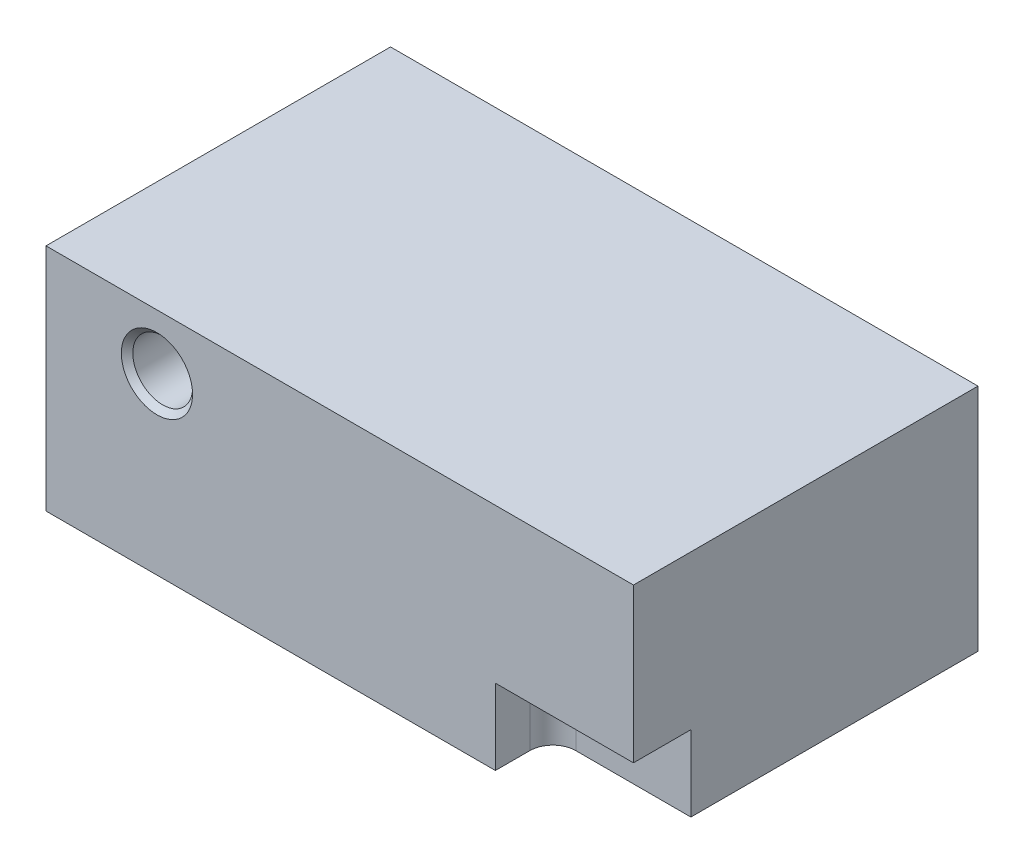
ISO-10303-21;
HEADER;
FILE_DESCRIPTION(('STEP AP214'),'2;1');
FILE_NAME('part.step','',(''),(''),'','','');
FILE_SCHEMA(('AUTOMOTIVE_DESIGN { 1 0 10303 214 1 1 1 1 }'));
ENDSEC;
DATA;
#1=APPLICATION_CONTEXT('core data for automotive mechanical design processes');
#2=APPLICATION_PROTOCOL_DEFINITION('international standard','automotive_design',2000,#1);
#3=PRODUCT_CONTEXT('',#1,'mechanical');
#4=PRODUCT('Part','Part','',(#3));
#5=PRODUCT_RELATED_PRODUCT_CATEGORY('part','',(#4));
#6=PRODUCT_DEFINITION_FORMATION('','',#4);
#7=PRODUCT_DEFINITION_CONTEXT('part definition',#1,'design');
#8=PRODUCT_DEFINITION('design','',#6,#7);
#9=PRODUCT_DEFINITION_SHAPE('','',#8);
#10=(LENGTH_UNIT() NAMED_UNIT(*) SI_UNIT(.MILLI.,.METRE.));
#11=(NAMED_UNIT(*) PLANE_ANGLE_UNIT() SI_UNIT($,.RADIAN.));
#12=(NAMED_UNIT(*) SI_UNIT($,.STERADIAN.) SOLID_ANGLE_UNIT());
#13=UNCERTAINTY_MEASURE_WITH_UNIT(LENGTH_MEASURE(1.E-05),#10,'distance_accuracy_value','');
#14=(GEOMETRIC_REPRESENTATION_CONTEXT(3) GLOBAL_UNCERTAINTY_ASSIGNED_CONTEXT((#13)) GLOBAL_UNIT_ASSIGNED_CONTEXT((#10,
#11,#12)) REPRESENTATION_CONTEXT('',''));
#15=CARTESIAN_POINT('',(0.,0.,0.));
#16=DIRECTION('',(0.,0.,1.));
#17=DIRECTION('',(1.,0.,0.));
#18=AXIS2_PLACEMENT_3D('',#15,#16,#17);
#19=CARTESIAN_POINT('',(0.,508.,0.));
#20=DIRECTION('',(1.,0.,0.));
#21=DIRECTION('',(0.,0.,-1.));
#22=AXIS2_PLACEMENT_3D('',#19,#20,#21);
#23=PLANE('',#22);
#24=DIRECTION('',(0.,0.,1.));
#25=VECTOR('',#24,1.);
#26=CARTESIAN_POINT('',(0.,0.,0.));
#27=LINE('',#26,#25);
#28=CARTESIAN_POINT('',(0.,0.,0.));
#29=VERTEX_POINT('',#28);
#30=CARTESIAN_POINT('',(0.,0.,762.));
#31=VERTEX_POINT('',#30);
#32=EDGE_CURVE('E156',#29,#31,#27,.T.);
#33=ORIENTED_EDGE('',*,*,#32,.T.);
#34=DIRECTION('',(0.,-1.,0.));
#35=VECTOR('',#34,1.);
#36=CARTESIAN_POINT('',(0.,508.,762.));
#37=LINE('',#36,#35);
#38=CARTESIAN_POINT('',(0.,508.,762.));
#39=VERTEX_POINT('',#38);
#40=EDGE_CURVE('E178',#39,#31,#37,.T.);
#41=ORIENTED_EDGE('',*,*,#40,.F.);
#42=DIRECTION('',(0.,0.,1.));
#43=VECTOR('',#42,1.);
#44=CARTESIAN_POINT('',(0.,508.,0.));
#45=LINE('',#44,#43);
#46=CARTESIAN_POINT('',(0.,508.,0.));
#47=VERTEX_POINT('',#46);
#48=EDGE_CURVE('E141',#47,#39,#45,.T.);
#49=ORIENTED_EDGE('',*,*,#48,.F.);
#50=DIRECTION('',(0.,-1.,0.));
#51=VECTOR('',#50,1.);
#52=CARTESIAN_POINT('',(0.,508.,0.));
#53=LINE('',#52,#51);
#54=EDGE_CURVE('E155',#47,#29,#53,.T.);
#55=ORIENTED_EDGE('',*,*,#54,.T.);
#56=EDGE_LOOP('',(#33,#41,#49,#55));
#57=FACE_BOUND('',#56,.T.);
#58=ADVANCED_FACE('F41',(#57),#23,.F.);
#59=CARTESIAN_POINT('',(0.,508.,762.));
#60=DIRECTION('',(0.,0.,-1.));
#61=DIRECTION('',(-1.,0.,0.));
#62=AXIS2_PLACEMENT_3D('',#59,#60,#61);
#63=PLANE('',#62);
#64=CARTESIAN_POINT('',(245.395602091104,385.783170348567,762.));
#65=DIRECTION('',(0.,0.,-1.));
#66=DIRECTION('',(-1.,0.,0.));
#67=AXIS2_PLACEMENT_3D('',#64,#65,#66);
#68=CIRCLE('',#67,78.765626010525);
#69=CARTESIAN_POINT('',(166.629976080579,385.783170348567,762.));
#70=VERTEX_POINT('',#69);
#71=EDGE_CURVE('E190',#70,#70,#68,.T.);
#72=ORIENTED_EDGE('',*,*,#71,.T.);
#73=EDGE_LOOP('',(#72));
#74=FACE_BOUND('',#73,.T.);
#75=DIRECTION('',(1.,0.,0.));
#76=VECTOR('',#75,1.);
#77=CARTESIAN_POINT('',(0.,0.,762.));
#78=LINE('',#77,#76);
#79=CARTESIAN_POINT('',(993.88614939054,0.,762.));
#80=VERTEX_POINT('',#79);
#81=EDGE_CURVE('E160',#31,#80,#78,.T.);
#82=ORIENTED_EDGE('',*,*,#81,.T.);
#83=DIRECTION('',(0.,-1.,0.));
#84=VECTOR('',#83,1.);
#85=CARTESIAN_POINT('',(993.88614939054,0.,762.));
#86=LINE('',#85,#84);
#87=CARTESIAN_POINT('',(993.88614939054,167.392745923611,762.));
#88=VERTEX_POINT('',#87);
#89=EDGE_CURVE('E124',#88,#80,#86,.T.);
#90=ORIENTED_EDGE('',*,*,#89,.F.);
#91=DIRECTION('',(-1.,0.,0.));
#92=VECTOR('',#91,1.);
#93=CARTESIAN_POINT('',(1299.22138671274,167.392745923611,762.));
#94=LINE('',#93,#92);
#95=CARTESIAN_POINT('',(1299.22138671274,167.392745923611,762.));
#96=VERTEX_POINT('',#95);
#97=EDGE_CURVE('E208',#96,#88,#94,.T.);
#98=ORIENTED_EDGE('',*,*,#97,.F.);
#99=DIRECTION('',(0.,-1.,0.));
#100=VECTOR('',#99,1.);
#101=CARTESIAN_POINT('',(1299.22138671274,508.,762.));
#102=LINE('',#101,#100);
#103=CARTESIAN_POINT('',(1299.22138671274,508.,762.));
#104=VERTEX_POINT('',#103);
#105=EDGE_CURVE('E130',#104,#96,#102,.T.);
#106=ORIENTED_EDGE('',*,*,#105,.F.);
#107=DIRECTION('',(1.,0.,0.));
#108=VECTOR('',#107,1.);
#109=CARTESIAN_POINT('',(0.,508.,762.));
#110=LINE('',#109,#108);
#111=EDGE_CURVE('E145',#39,#104,#110,.T.);
#112=ORIENTED_EDGE('',*,*,#111,.F.);
#113=ORIENTED_EDGE('',*,*,#40,.T.);
#114=EDGE_LOOP('',(#82,#90,#98,#106,#112,#113));
#115=FACE_BOUND('',#114,.T.);
#116=ADVANCED_FACE('F212',(#74,#115),#63,.F.);
#117=CARTESIAN_POINT('',(1299.22138671274,508.,0.));
#118=DIRECTION('',(-1.,0.,0.));
#119=DIRECTION('',(0.,0.,1.));
#120=AXIS2_PLACEMENT_3D('',#117,#118,#119);
#121=PLANE('',#120);
#122=ORIENTED_EDGE('',*,*,#105,.T.);
#123=DIRECTION('',(0.,0.,1.));
#124=VECTOR('',#123,1.);
#125=CARTESIAN_POINT('',(1299.22138671274,167.392745923611,635.));
#126=LINE('',#125,#124);
#127=CARTESIAN_POINT('',(1299.22138671274,167.392745923611,635.));
#128=VERTEX_POINT('',#127);
#129=EDGE_CURVE('E109',#128,#96,#126,.T.);
#130=ORIENTED_EDGE('',*,*,#129,.F.);
#131=DIRECTION('',(0.,1.,0.));
#132=VECTOR('',#131,1.);
#133=CARTESIAN_POINT('',(1299.22138671274,0.,635.));
#134=LINE('',#133,#132);
#135=CARTESIAN_POINT('',(1299.22138671274,0.,635.));
#136=VERTEX_POINT('',#135);
#137=EDGE_CURVE('E117',#136,#128,#134,.T.);
#138=ORIENTED_EDGE('',*,*,#137,.F.);
#139=DIRECTION('',(0.,0.,-1.));
#140=VECTOR('',#139,1.);
#141=CARTESIAN_POINT('',(1299.22138671274,0.,0.));
#142=LINE('',#141,#140);
#143=CARTESIAN_POINT('',(1299.22138671274,0.,0.));
#144=VERTEX_POINT('',#143);
#145=EDGE_CURVE('E164',#136,#144,#142,.T.);
#146=ORIENTED_EDGE('',*,*,#145,.T.);
#147=DIRECTION('',(0.,-1.,0.));
#148=VECTOR('',#147,1.);
#149=CARTESIAN_POINT('',(1299.22138671274,508.,0.));
#150=LINE('',#149,#148);
#151=CARTESIAN_POINT('',(1299.22138671274,508.,0.));
#152=VERTEX_POINT('',#151);
#153=EDGE_CURVE('E172',#152,#144,#150,.T.);
#154=ORIENTED_EDGE('',*,*,#153,.F.);
#155=DIRECTION('',(0.,0.,-1.));
#156=VECTOR('',#155,1.);
#157=CARTESIAN_POINT('',(1299.22138671274,508.,0.));
#158=LINE('',#157,#156);
#159=EDGE_CURVE('E149',#104,#152,#158,.T.);
#160=ORIENTED_EDGE('',*,*,#159,.F.);
#161=EDGE_LOOP('',(#122,#130,#138,#146,#154,#160));
#162=FACE_BOUND('',#161,.T.);
#163=ADVANCED_FACE('F127',(#162),#121,.F.);
#164=CARTESIAN_POINT('',(0.,508.,0.));
#165=DIRECTION('',(0.,0.,1.));
#166=DIRECTION('',(1.,0.,0.));
#167=AXIS2_PLACEMENT_3D('',#164,#165,#166);
#168=PLANE('',#167);
#169=CARTESIAN_POINT('',(245.395602091104,385.783170348567,0.));
#170=DIRECTION('',(0.,0.,1.));
#171=DIRECTION('',(1.,0.,0.));
#172=AXIS2_PLACEMENT_3D('',#169,#170,#171);
#173=CIRCLE('',#172,78.7656260105245);
#174=CARTESIAN_POINT('',(324.161228101628,385.783170348567,0.));
#175=VERTEX_POINT('',#174);
#176=EDGE_CURVE('E194',#175,#175,#173,.T.);
#177=ORIENTED_EDGE('',*,*,#176,.T.);
#178=EDGE_LOOP('',(#177));
#179=FACE_BOUND('',#178,.T.);
#180=DIRECTION('',(-1.,0.,0.));
#181=VECTOR('',#180,1.);
#182=CARTESIAN_POINT('',(0.,0.,0.));
#183=LINE('',#182,#181);
#184=EDGE_CURVE('E146',#144,#29,#183,.T.);
#185=ORIENTED_EDGE('',*,*,#184,.T.);
#186=ORIENTED_EDGE('',*,*,#54,.F.);
#187=DIRECTION('',(-1.,0.,0.));
#188=VECTOR('',#187,1.);
#189=CARTESIAN_POINT('',(0.,508.,0.));
#190=LINE('',#189,#188);
#191=EDGE_CURVE('E152',#152,#47,#190,.T.);
#192=ORIENTED_EDGE('',*,*,#191,.F.);
#193=ORIENTED_EDGE('',*,*,#153,.T.);
#194=EDGE_LOOP('',(#185,#186,#192,#193));
#195=FACE_BOUND('',#194,.T.);
#196=ADVANCED_FACE('F221',(#179,#195),#168,.F.);
#197=CARTESIAN_POINT('',(0.,508.,0.));
#198=DIRECTION('',(0.,1.,0.));
#199=DIRECTION('',(0.,0.,1.));
#200=AXIS2_PLACEMENT_3D('',#197,#198,#199);
#201=PLANE('',#200);
#202=ORIENTED_EDGE('',*,*,#48,.T.);
#203=ORIENTED_EDGE('',*,*,#111,.T.);
#204=ORIENTED_EDGE('',*,*,#159,.T.);
#205=ORIENTED_EDGE('',*,*,#191,.T.);
#206=EDGE_LOOP('',(#202,#203,#204,#205));
#207=FACE_BOUND('',#206,.T.);
#208=ADVANCED_FACE('F225',(#207),#201,.T.);
#209=CARTESIAN_POINT('',(0.,0.,0.));
#210=DIRECTION('',(0.,1.,0.));
#211=DIRECTION('',(0.,0.,1.));
#212=AXIS2_PLACEMENT_3D('',#209,#210,#211);
#213=PLANE('',#212);
#214=DIRECTION('',(1.,0.,0.));
#215=VECTOR('',#214,1.);
#216=CARTESIAN_POINT('',(1299.22138671274,0.,635.));
#217=LINE('',#216,#215);
#218=CARTESIAN_POINT('',(1044.68614939054,0.,635.));
#219=VERTEX_POINT('',#218);
#220=EDGE_CURVE('E116',#219,#136,#217,.T.);
#221=ORIENTED_EDGE('',*,*,#220,.F.);
#222=CARTESIAN_POINT('',(1044.68614939054,0.,685.8));
#223=DIRECTION('',(0.,1.,0.));
#224=DIRECTION('',(0.,0.,1.));
#225=AXIS2_PLACEMENT_3D('',#222,#223,#224);
#226=CIRCLE('',#225,50.8);
#227=CARTESIAN_POINT('',(993.88614939054,0.,685.8));
#228=VERTEX_POINT('',#227);
#229=EDGE_CURVE('E11',#219,#228,#226,.T.);
#230=ORIENTED_EDGE('',*,*,#229,.T.);
#231=DIRECTION('',(0.,0.,1.));
#232=VECTOR('',#231,1.);
#233=CARTESIAN_POINT('',(993.88614939054,0.,635.));
#234=LINE('',#233,#232);
#235=EDGE_CURVE('E136',#228,#80,#234,.T.);
#236=ORIENTED_EDGE('',*,*,#235,.T.);
#237=ORIENTED_EDGE('',*,*,#81,.F.);
#238=ORIENTED_EDGE('',*,*,#32,.F.);
#239=ORIENTED_EDGE('',*,*,#184,.F.);
#240=ORIENTED_EDGE('',*,*,#145,.F.);
#241=EDGE_LOOP('',(#221,#230,#236,#237,#238,#239,#240));
#242=FACE_BOUND('',#241,.T.);
#243=ADVANCED_FACE('F215',(#242),#213,.F.);
#244=CARTESIAN_POINT('',(245.395602091104,385.783170348567,0.));
#245=DIRECTION('',(0.,0.,1.));
#246=DIRECTION('',(1.,0.,0.));
#247=AXIS2_PLACEMENT_3D('',#244,#245,#246);
#248=CYLINDRICAL_SURFACE('',#247,66.0656260105247);
#249=CARTESIAN_POINT('',(245.395602091104,385.783170348567,749.299999999999));
#250=DIRECTION('',(0.,0.,-1.));
#251=DIRECTION('',(-1.,0.,0.));
#252=AXIS2_PLACEMENT_3D('',#249,#250,#251);
#253=CIRCLE('',#252,66.0656260105247);
#254=CARTESIAN_POINT('',(179.329976080579,385.783170348567,749.299999999999));
#255=VERTEX_POINT('',#254);
#256=EDGE_CURVE('E186',#255,#255,#253,.F.);
#257=ORIENTED_EDGE('',*,*,#256,.T.);
#258=EDGE_LOOP('',(#257));
#259=FACE_BOUND('',#258,.T.);
#260=CARTESIAN_POINT('',(245.395602091104,385.783170348567,12.6999999999999));
#261=DIRECTION('',(0.,0.,1.));
#262=DIRECTION('',(1.,0.,0.));
#263=AXIS2_PLACEMENT_3D('',#260,#261,#262);
#264=CIRCLE('',#263,66.0656260105247);
#265=CARTESIAN_POINT('',(311.461228101628,385.783170348567,12.6999999999999));
#266=VERTEX_POINT('',#265);
#267=EDGE_CURVE('E182',#266,#266,#264,.F.);
#268=ORIENTED_EDGE('',*,*,#267,.T.);
#269=EDGE_LOOP('',(#268));
#270=FACE_BOUND('',#269,.T.);
#271=ADVANCED_FACE('F244',(#259,#270),#248,.F.);
#272=CARTESIAN_POINT('',(245.395602091104,385.783170348567,749.299999999999));
#273=DIRECTION('',(0.,0.,1.));
#274=DIRECTION('',(1.,0.,0.));
#275=AXIS2_PLACEMENT_3D('',#272,#273,#274);
#276=CONICAL_SURFACE('',#275,66.0656260105247,0.78539816339744);
#277=ORIENTED_EDGE('',*,*,#71,.F.);
#278=EDGE_LOOP('',(#277));
#279=FACE_BOUND('',#278,.T.);
#280=ORIENTED_EDGE('',*,*,#256,.F.);
#281=EDGE_LOOP('',(#280));
#282=FACE_BOUND('',#281,.T.);
#283=ADVANCED_FACE('F238',(#279,#282),#276,.F.);
#284=CARTESIAN_POINT('',(245.395602091104,385.783170348567,0.));
#285=DIRECTION('',(0.,0.,-1.));
#286=DIRECTION('',(-1.,0.,0.));
#287=AXIS2_PLACEMENT_3D('',#284,#285,#286);
#288=CONICAL_SURFACE('',#287,78.7656260105245,0.785398163397445);
#289=ORIENTED_EDGE('',*,*,#267,.F.);
#290=EDGE_LOOP('',(#289));
#291=FACE_BOUND('',#290,.T.);
#292=ORIENTED_EDGE('',*,*,#176,.F.);
#293=EDGE_LOOP('',(#292));
#294=FACE_BOUND('',#293,.T.);
#295=ADVANCED_FACE('F243',(#291,#294),#288,.F.);
#296=CARTESIAN_POINT('',(993.88614939054,0.,635.));
#297=DIRECTION('',(-1.,0.,0.));
#298=DIRECTION('',(0.,0.,1.));
#299=AXIS2_PLACEMENT_3D('',#296,#297,#298);
#300=PLANE('',#299);
#301=ORIENTED_EDGE('',*,*,#235,.F.);
#302=DIRECTION('',(0.,-1.,0.));
#303=VECTOR('',#302,1.);
#304=CARTESIAN_POINT('',(993.88614939054,0.,685.8));
#305=LINE('',#304,#303);
#306=CARTESIAN_POINT('',(993.88614939054,167.392745923611,685.8));
#307=VERTEX_POINT('',#306);
#308=EDGE_CURVE('E57',#228,#307,#305,.F.);
#309=ORIENTED_EDGE('',*,*,#308,.T.);
#310=DIRECTION('',(0.,0.,1.));
#311=VECTOR('',#310,1.);
#312=CARTESIAN_POINT('',(993.88614939054,167.392745923611,635.));
#313=LINE('',#312,#311);
#314=EDGE_CURVE('E132',#307,#88,#313,.T.);
#315=ORIENTED_EDGE('',*,*,#314,.T.);
#316=ORIENTED_EDGE('',*,*,#89,.T.);
#317=EDGE_LOOP('',(#301,#309,#315,#316));
#318=FACE_BOUND('',#317,.T.);
#319=ADVANCED_FACE('F213',(#318),#300,.F.);
#320=CARTESIAN_POINT('',(1299.22138671274,167.392745923611,635.));
#321=DIRECTION('',(0.,1.,0.));
#322=DIRECTION('',(0.,0.,1.));
#323=AXIS2_PLACEMENT_3D('',#320,#321,#322);
#324=PLANE('',#323);
#325=ORIENTED_EDGE('',*,*,#314,.F.);
#326=CARTESIAN_POINT('',(1044.68614939054,167.392745923611,685.8));
#327=DIRECTION('',(0.,1.,0.));
#328=DIRECTION('',(0.,0.,1.));
#329=AXIS2_PLACEMENT_3D('',#326,#327,#328);
#330=CIRCLE('',#329,50.8);
#331=CARTESIAN_POINT('',(1044.68614939054,167.392745923611,635.));
#332=VERTEX_POINT('',#331);
#333=EDGE_CURVE('E50',#307,#332,#330,.F.);
#334=ORIENTED_EDGE('',*,*,#333,.T.);
#335=DIRECTION('',(-1.,0.,0.));
#336=VECTOR('',#335,1.);
#337=CARTESIAN_POINT('',(1299.22138671274,167.392745923611,635.));
#338=LINE('',#337,#336);
#339=EDGE_CURVE('E104',#128,#332,#338,.T.);
#340=ORIENTED_EDGE('',*,*,#339,.F.);
#341=ORIENTED_EDGE('',*,*,#129,.T.);
#342=ORIENTED_EDGE('',*,*,#97,.T.);
#343=EDGE_LOOP('',(#325,#334,#340,#341,#342));
#344=FACE_BOUND('',#343,.T.);
#345=ADVANCED_FACE('F106',(#344),#324,.F.);
#346=CARTESIAN_POINT('',(0.,0.,635.));
#347=DIRECTION('',(0.,0.,1.));
#348=DIRECTION('',(1.,0.,0.));
#349=AXIS2_PLACEMENT_3D('',#346,#347,#348);
#350=PLANE('',#349);
#351=ORIENTED_EDGE('',*,*,#339,.T.);
#352=DIRECTION('',(0.,-1.,0.));
#353=VECTOR('',#352,1.);
#354=CARTESIAN_POINT('',(1044.68614939054,0.,635.));
#355=LINE('',#354,#353);
#356=EDGE_CURVE('E198',#332,#219,#355,.T.);
#357=ORIENTED_EDGE('',*,*,#356,.T.);
#358=ORIENTED_EDGE('',*,*,#220,.T.);
#359=ORIENTED_EDGE('',*,*,#137,.T.);
#360=EDGE_LOOP('',(#351,#357,#358,#359));
#361=FACE_BOUND('',#360,.T.);
#362=ADVANCED_FACE('F120',(#361),#350,.T.);
#363=CARTESIAN_POINT('',(1044.68614939054,0.,685.8));
#364=DIRECTION('',(0.,-1.,0.));
#365=DIRECTION('',(0.,0.,-1.));
#366=AXIS2_PLACEMENT_3D('',#363,#364,#365);
#367=CYLINDRICAL_SURFACE('',#366,50.8);
#368=ORIENTED_EDGE('',*,*,#333,.F.);
#369=ORIENTED_EDGE('',*,*,#308,.F.);
#370=ORIENTED_EDGE('',*,*,#229,.F.);
#371=ORIENTED_EDGE('',*,*,#356,.F.);
#372=EDGE_LOOP('',(#368,#369,#370,#371));
#373=FACE_BOUND('',#372,.T.);
#374=ADVANCED_FACE('F43',(#373),#367,.F.);
#375=CLOSED_SHELL('',(#58,#116,#163,#196,#208,#243,#271,#283,#295,#319,#345,#362,#374));
#376=MANIFOLD_SOLID_BREP('B2',#375);
#377=ADVANCED_BREP_SHAPE_REPRESENTATION('',(#18,#376),#14);
#378=SHAPE_DEFINITION_REPRESENTATION(#9,#377);
ENDSEC;
END-ISO-10303-21;
